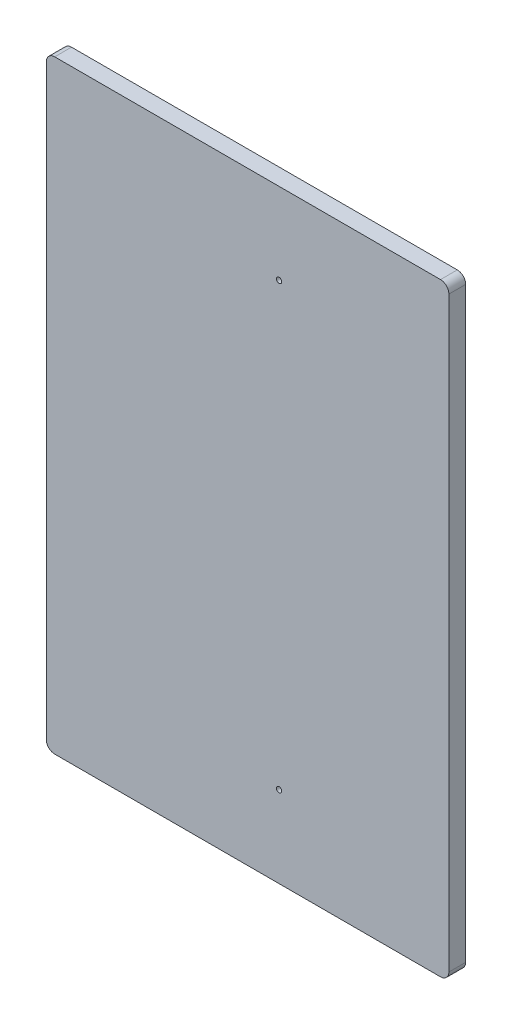
ISO-10303-21;
HEADER;
FILE_DESCRIPTION(('STEP AP214'),'2;1');
FILE_NAME('part.step','',(''),(''),'','','');
FILE_SCHEMA(('AUTOMOTIVE_DESIGN { 1 0 10303 214 1 1 1 1 }'));
ENDSEC;
DATA;
#1=APPLICATION_CONTEXT('core data for automotive mechanical design processes');
#2=APPLICATION_PROTOCOL_DEFINITION('international standard','automotive_design',2000,#1);
#3=PRODUCT_CONTEXT('',#1,'mechanical');
#4=PRODUCT('Part','Part','',(#3));
#5=PRODUCT_RELATED_PRODUCT_CATEGORY('part','',(#4));
#6=PRODUCT_DEFINITION_FORMATION('','',#4);
#7=PRODUCT_DEFINITION_CONTEXT('part definition',#1,'design');
#8=PRODUCT_DEFINITION('design','',#6,#7);
#9=PRODUCT_DEFINITION_SHAPE('','',#8);
#10=(LENGTH_UNIT() NAMED_UNIT(*) SI_UNIT(.MILLI.,.METRE.));
#11=(NAMED_UNIT(*) PLANE_ANGLE_UNIT() SI_UNIT($,.RADIAN.));
#12=(NAMED_UNIT(*) SI_UNIT($,.STERADIAN.) SOLID_ANGLE_UNIT());
#13=UNCERTAINTY_MEASURE_WITH_UNIT(LENGTH_MEASURE(1.E-05),#10,'distance_accuracy_value','');
#14=(GEOMETRIC_REPRESENTATION_CONTEXT(3) GLOBAL_UNCERTAINTY_ASSIGNED_CONTEXT((#13)) GLOBAL_UNIT_ASSIGNED_CONTEXT((#10,
#11,#12)) REPRESENTATION_CONTEXT('',''));
#15=CARTESIAN_POINT('',(0.,0.,0.));
#16=DIRECTION('',(0.,0.,1.));
#17=DIRECTION('',(1.,0.,0.));
#18=AXIS2_PLACEMENT_3D('',#15,#16,#17);
#19=CARTESIAN_POINT('',(152.4,228.6,12.7));
#20=DIRECTION('',(-1.,0.,0.));
#21=DIRECTION('',(0.,0.,1.));
#22=AXIS2_PLACEMENT_3D('',#19,#20,#21);
#23=PLANE('',#22);
#24=DIRECTION('',(0.,1.,0.));
#25=VECTOR('',#24,1.);
#26=CARTESIAN_POINT('',(152.4,228.6,0.));
#27=LINE('',#26,#25);
#28=CARTESIAN_POINT('',(152.4,-222.25,0.));
#29=VERTEX_POINT('',#28);
#30=CARTESIAN_POINT('',(152.4,222.25,0.));
#31=VERTEX_POINT('',#30);
#32=EDGE_CURVE('E128',#29,#31,#27,.T.);
#33=ORIENTED_EDGE('',*,*,#32,.T.);
#34=DIRECTION('',(0.,0.,-1.));
#35=VECTOR('',#34,1.);
#36=CARTESIAN_POINT('',(152.4,222.25,12.7));
#37=LINE('',#36,#35);
#38=CARTESIAN_POINT('',(152.4,222.25,12.7));
#39=VERTEX_POINT('',#38);
#40=EDGE_CURVE('E106',#31,#39,#37,.F.);
#41=ORIENTED_EDGE('',*,*,#40,.T.);
#42=DIRECTION('',(0.,1.,0.));
#43=VECTOR('',#42,1.);
#44=CARTESIAN_POINT('',(152.4,228.6,12.7));
#45=LINE('',#44,#43);
#46=CARTESIAN_POINT('',(152.4,-222.25,12.7));
#47=VERTEX_POINT('',#46);
#48=EDGE_CURVE('E138',#47,#39,#45,.T.);
#49=ORIENTED_EDGE('',*,*,#48,.F.);
#50=DIRECTION('',(0.,0.,-1.));
#51=VECTOR('',#50,1.);
#52=CARTESIAN_POINT('',(152.4,-222.25,12.7));
#53=LINE('',#52,#51);
#54=EDGE_CURVE('E111',#47,#29,#53,.T.);
#55=ORIENTED_EDGE('',*,*,#54,.T.);
#56=EDGE_LOOP('',(#33,#41,#49,#55));
#57=FACE_BOUND('',#56,.T.);
#58=ADVANCED_FACE('F35',(#57),#23,.F.);
#59=CARTESIAN_POINT('',(152.4,228.6,12.7));
#60=DIRECTION('',(0.,-1.,0.));
#61=DIRECTION('',(0.,0.,-1.));
#62=AXIS2_PLACEMENT_3D('',#59,#60,#61);
#63=PLANE('',#62);
#64=DIRECTION('',(-1.,0.,0.));
#65=VECTOR('',#64,1.);
#66=CARTESIAN_POINT('',(152.4,228.6,12.7));
#67=LINE('',#66,#65);
#68=CARTESIAN_POINT('',(146.05,228.6,12.7));
#69=VERTEX_POINT('',#68);
#70=CARTESIAN_POINT('',(-146.05,228.6,12.7));
#71=VERTEX_POINT('',#70);
#72=EDGE_CURVE('E121',#69,#71,#67,.T.);
#73=ORIENTED_EDGE('',*,*,#72,.F.);
#74=DIRECTION('',(0.,0.,-1.));
#75=VECTOR('',#74,1.);
#76=CARTESIAN_POINT('',(146.05,228.6,12.7));
#77=LINE('',#76,#75);
#78=CARTESIAN_POINT('',(146.05,228.6,0.));
#79=VERTEX_POINT('',#78);
#80=EDGE_CURVE('E105',#69,#79,#77,.T.);
#81=ORIENTED_EDGE('',*,*,#80,.T.);
#82=DIRECTION('',(-1.,0.,0.));
#83=VECTOR('',#82,1.);
#84=CARTESIAN_POINT('',(152.4,228.6,0.));
#85=LINE('',#84,#83);
#86=CARTESIAN_POINT('',(-146.05,228.6,0.));
#87=VERTEX_POINT('',#86);
#88=EDGE_CURVE('E118',#79,#87,#85,.T.);
#89=ORIENTED_EDGE('',*,*,#88,.T.);
#90=DIRECTION('',(0.,0.,-1.));
#91=VECTOR('',#90,1.);
#92=CARTESIAN_POINT('',(-146.05,228.6,12.7));
#93=LINE('',#92,#91);
#94=EDGE_CURVE('E123',#87,#71,#93,.F.);
#95=ORIENTED_EDGE('',*,*,#94,.T.);
#96=EDGE_LOOP('',(#73,#81,#89,#95));
#97=FACE_BOUND('',#96,.T.);
#98=ADVANCED_FACE('F117',(#97),#63,.F.);
#99=CARTESIAN_POINT('',(-152.4,228.6,12.7));
#100=DIRECTION('',(1.,0.,0.));
#101=DIRECTION('',(0.,0.,-1.));
#102=AXIS2_PLACEMENT_3D('',#99,#100,#101);
#103=PLANE('',#102);
#104=DIRECTION('',(0.,-1.,0.));
#105=VECTOR('',#104,1.);
#106=CARTESIAN_POINT('',(-152.4,228.6,0.));
#107=LINE('',#106,#105);
#108=CARTESIAN_POINT('',(-152.4,222.25,0.));
#109=VERTEX_POINT('',#108);
#110=CARTESIAN_POINT('',(-152.4,-222.25,0.));
#111=VERTEX_POINT('',#110);
#112=EDGE_CURVE('E127',#109,#111,#107,.T.);
#113=ORIENTED_EDGE('',*,*,#112,.T.);
#114=DIRECTION('',(0.,0.,-1.));
#115=VECTOR('',#114,1.);
#116=CARTESIAN_POINT('',(-152.4,-222.25,12.7));
#117=LINE('',#116,#115);
#118=CARTESIAN_POINT('',(-152.4,-222.25,12.7));
#119=VERTEX_POINT('',#118);
#120=EDGE_CURVE('E11',#111,#119,#117,.F.);
#121=ORIENTED_EDGE('',*,*,#120,.T.);
#122=DIRECTION('',(0.,-1.,0.));
#123=VECTOR('',#122,1.);
#124=CARTESIAN_POINT('',(-152.4,228.6,12.7));
#125=LINE('',#124,#123);
#126=CARTESIAN_POINT('',(-152.4,222.25,12.7));
#127=VERTEX_POINT('',#126);
#128=EDGE_CURVE('E164',#127,#119,#125,.T.);
#129=ORIENTED_EDGE('',*,*,#128,.F.);
#130=DIRECTION('',(0.,0.,-1.));
#131=VECTOR('',#130,1.);
#132=CARTESIAN_POINT('',(-152.4,222.25,12.7));
#133=LINE('',#132,#131);
#134=EDGE_CURVE('E43',#127,#109,#133,.T.);
#135=ORIENTED_EDGE('',*,*,#134,.T.);
#136=EDGE_LOOP('',(#113,#121,#129,#135));
#137=FACE_BOUND('',#136,.T.);
#138=ADVANCED_FACE('F162',(#137),#103,.F.);
#139=CARTESIAN_POINT('',(152.4,-228.6,12.7));
#140=DIRECTION('',(0.,1.,0.));
#141=DIRECTION('',(0.,0.,1.));
#142=AXIS2_PLACEMENT_3D('',#139,#140,#141);
#143=PLANE('',#142);
#144=DIRECTION('',(1.,0.,0.));
#145=VECTOR('',#144,1.);
#146=CARTESIAN_POINT('',(152.4,-228.6,0.));
#147=LINE('',#146,#145);
#148=CARTESIAN_POINT('',(-146.05,-228.6,0.));
#149=VERTEX_POINT('',#148);
#150=CARTESIAN_POINT('',(146.05,-228.6,0.));
#151=VERTEX_POINT('',#150);
#152=EDGE_CURVE('E131',#149,#151,#147,.T.);
#153=ORIENTED_EDGE('',*,*,#152,.T.);
#154=DIRECTION('',(0.,0.,-1.));
#155=VECTOR('',#154,1.);
#156=CARTESIAN_POINT('',(146.05,-228.6,12.7));
#157=LINE('',#156,#155);
#158=CARTESIAN_POINT('',(146.05,-228.6,12.7));
#159=VERTEX_POINT('',#158);
#160=EDGE_CURVE('E50',#151,#159,#157,.F.);
#161=ORIENTED_EDGE('',*,*,#160,.T.);
#162=DIRECTION('',(1.,0.,0.));
#163=VECTOR('',#162,1.);
#164=CARTESIAN_POINT('',(152.4,-228.6,12.7));
#165=LINE('',#164,#163);
#166=CARTESIAN_POINT('',(-146.05,-228.6,12.7));
#167=VERTEX_POINT('',#166);
#168=EDGE_CURVE('E139',#167,#159,#165,.T.);
#169=ORIENTED_EDGE('',*,*,#168,.F.);
#170=DIRECTION('',(0.,0.,-1.));
#171=VECTOR('',#170,1.);
#172=CARTESIAN_POINT('',(-146.05,-228.6,12.7));
#173=LINE('',#172,#171);
#174=EDGE_CURVE('E155',#167,#149,#173,.T.);
#175=ORIENTED_EDGE('',*,*,#174,.T.);
#176=EDGE_LOOP('',(#153,#161,#169,#175));
#177=FACE_BOUND('',#176,.T.);
#178=ADVANCED_FACE('F171',(#177),#143,.F.);
#179=CARTESIAN_POINT('',(152.4,-228.6,12.7));
#180=DIRECTION('',(0.,0.,-1.));
#181=DIRECTION('',(-1.,0.,0.));
#182=AXIS2_PLACEMENT_3D('',#179,#180,#181);
#183=PLANE('',#182);
#184=CARTESIAN_POINT('',(23.8125,-167.005,12.7));
#185=DIRECTION('',(0.,0.,-1.));
#186=DIRECTION('',(-1.,0.,0.));
#187=AXIS2_PLACEMENT_3D('',#184,#185,#186);
#188=CIRCLE('',#187,2.0193);
#189=CARTESIAN_POINT('',(21.7932,-167.005,12.7));
#190=VERTEX_POINT('',#189);
#191=EDGE_CURVE('E183',#190,#190,#188,.T.);
#192=ORIENTED_EDGE('',*,*,#191,.T.);
#193=EDGE_LOOP('',(#192));
#194=FACE_BOUND('',#193,.T.);
#195=CARTESIAN_POINT('',(23.8125,167.005,12.7));
#196=DIRECTION('',(0.,0.,-1.));
#197=DIRECTION('',(-1.,0.,0.));
#198=AXIS2_PLACEMENT_3D('',#195,#196,#197);
#199=CIRCLE('',#198,2.0193);
#200=CARTESIAN_POINT('',(21.7932,167.005,12.7));
#201=VERTEX_POINT('',#200);
#202=EDGE_CURVE('E133',#201,#201,#199,.T.);
#203=ORIENTED_EDGE('',*,*,#202,.T.);
#204=EDGE_LOOP('',(#203));
#205=FACE_BOUND('',#204,.T.);
#206=ORIENTED_EDGE('',*,*,#48,.T.);
#207=CARTESIAN_POINT('',(146.05,222.25,12.7));
#208=DIRECTION('',(0.,0.,-1.));
#209=DIRECTION('',(-1.,0.,0.));
#210=AXIS2_PLACEMENT_3D('',#207,#208,#209);
#211=CIRCLE('',#210,6.35);
#212=EDGE_CURVE('E153',#39,#69,#211,.F.);
#213=ORIENTED_EDGE('',*,*,#212,.T.);
#214=ORIENTED_EDGE('',*,*,#72,.T.);
#215=CARTESIAN_POINT('',(-146.05,222.25,12.7));
#216=DIRECTION('',(0.,0.,-1.));
#217=DIRECTION('',(-1.,0.,0.));
#218=AXIS2_PLACEMENT_3D('',#215,#216,#217);
#219=CIRCLE('',#218,6.35);
#220=EDGE_CURVE('E148',#71,#127,#219,.F.);
#221=ORIENTED_EDGE('',*,*,#220,.T.);
#222=ORIENTED_EDGE('',*,*,#128,.T.);
#223=CARTESIAN_POINT('',(-146.05,-222.25,12.7));
#224=DIRECTION('',(0.,0.,-1.));
#225=DIRECTION('',(-1.,0.,0.));
#226=AXIS2_PLACEMENT_3D('',#223,#224,#225);
#227=CIRCLE('',#226,6.35);
#228=EDGE_CURVE('E57',#119,#167,#227,.F.);
#229=ORIENTED_EDGE('',*,*,#228,.T.);
#230=ORIENTED_EDGE('',*,*,#168,.T.);
#231=CARTESIAN_POINT('',(146.05,-222.25,12.7));
#232=DIRECTION('',(0.,0.,-1.));
#233=DIRECTION('',(-1.,0.,0.));
#234=AXIS2_PLACEMENT_3D('',#231,#232,#233);
#235=CIRCLE('',#234,6.35);
#236=EDGE_CURVE('E151',#159,#47,#235,.F.);
#237=ORIENTED_EDGE('',*,*,#236,.T.);
#238=EDGE_LOOP('',(#206,#213,#214,#221,#222,#229,#230,#237));
#239=FACE_BOUND('',#238,.T.);
#240=ADVANCED_FACE('F194',(#194,#205,#239),#183,.F.);
#241=CARTESIAN_POINT('',(152.4,-228.6,0.));
#242=DIRECTION('',(0.,0.,-1.));
#243=DIRECTION('',(-1.,0.,0.));
#244=AXIS2_PLACEMENT_3D('',#241,#242,#243);
#245=PLANE('',#244);
#246=CARTESIAN_POINT('',(23.8125,-167.005,0.));
#247=DIRECTION('',(0.,0.,-1.));
#248=DIRECTION('',(-1.,0.,0.));
#249=AXIS2_PLACEMENT_3D('',#246,#247,#248);
#250=CIRCLE('',#249,2.01929999999999);
#251=CARTESIAN_POINT('',(21.7932,-167.005,0.));
#252=VERTEX_POINT('',#251);
#253=EDGE_CURVE('E186',#252,#252,#250,.T.);
#254=ORIENTED_EDGE('',*,*,#253,.F.);
#255=EDGE_LOOP('',(#254));
#256=FACE_BOUND('',#255,.T.);
#257=CARTESIAN_POINT('',(23.8125,167.005,0.));
#258=DIRECTION('',(0.,0.,-1.));
#259=DIRECTION('',(-1.,0.,0.));
#260=AXIS2_PLACEMENT_3D('',#257,#258,#259);
#261=CIRCLE('',#260,2.01929999999999);
#262=CARTESIAN_POINT('',(21.7932,167.005,0.));
#263=VERTEX_POINT('',#262);
#264=EDGE_CURVE('E180',#263,#263,#261,.T.);
#265=ORIENTED_EDGE('',*,*,#264,.F.);
#266=EDGE_LOOP('',(#265));
#267=FACE_BOUND('',#266,.T.);
#268=ORIENTED_EDGE('',*,*,#88,.F.);
#269=CARTESIAN_POINT('',(146.05,222.25,0.));
#270=DIRECTION('',(0.,0.,-1.));
#271=DIRECTION('',(-1.,0.,0.));
#272=AXIS2_PLACEMENT_3D('',#269,#270,#271);
#273=CIRCLE('',#272,6.35);
#274=EDGE_CURVE('E101',#79,#31,#273,.T.);
#275=ORIENTED_EDGE('',*,*,#274,.T.);
#276=ORIENTED_EDGE('',*,*,#32,.F.);
#277=CARTESIAN_POINT('',(146.05,-222.25,0.));
#278=DIRECTION('',(0.,0.,-1.));
#279=DIRECTION('',(-1.,0.,0.));
#280=AXIS2_PLACEMENT_3D('',#277,#278,#279);
#281=CIRCLE('',#280,6.35);
#282=EDGE_CURVE('E112',#29,#151,#281,.T.);
#283=ORIENTED_EDGE('',*,*,#282,.T.);
#284=ORIENTED_EDGE('',*,*,#152,.F.);
#285=CARTESIAN_POINT('',(-146.05,-222.25,0.));
#286=DIRECTION('',(0.,0.,-1.));
#287=DIRECTION('',(-1.,0.,0.));
#288=AXIS2_PLACEMENT_3D('',#285,#286,#287);
#289=CIRCLE('',#288,6.35);
#290=EDGE_CURVE('E142',#149,#111,#289,.T.);
#291=ORIENTED_EDGE('',*,*,#290,.T.);
#292=ORIENTED_EDGE('',*,*,#112,.F.);
#293=CARTESIAN_POINT('',(-146.05,222.25,0.));
#294=DIRECTION('',(0.,0.,-1.));
#295=DIRECTION('',(-1.,0.,0.));
#296=AXIS2_PLACEMENT_3D('',#293,#294,#295);
#297=CIRCLE('',#296,6.35);
#298=EDGE_CURVE('E122',#109,#87,#297,.T.);
#299=ORIENTED_EDGE('',*,*,#298,.T.);
#300=EDGE_LOOP('',(#268,#275,#276,#283,#284,#291,#292,#299));
#301=FACE_BOUND('',#300,.T.);
#302=ADVANCED_FACE('F125',(#256,#267,#301),#245,.T.);
#303=CARTESIAN_POINT('',(146.05,222.25,12.7));
#304=DIRECTION('',(0.,0.,-1.));
#305=DIRECTION('',(-1.,0.,0.));
#306=AXIS2_PLACEMENT_3D('',#303,#304,#305);
#307=CYLINDRICAL_SURFACE('',#306,6.35);
#308=ORIENTED_EDGE('',*,*,#212,.F.);
#309=ORIENTED_EDGE('',*,*,#40,.F.);
#310=ORIENTED_EDGE('',*,*,#274,.F.);
#311=ORIENTED_EDGE('',*,*,#80,.F.);
#312=EDGE_LOOP('',(#308,#309,#310,#311));
#313=FACE_BOUND('',#312,.T.);
#314=ADVANCED_FACE('F104',(#313),#307,.T.);
#315=CARTESIAN_POINT('',(146.05,-222.25,12.7));
#316=DIRECTION('',(0.,0.,-1.));
#317=DIRECTION('',(-1.,0.,0.));
#318=AXIS2_PLACEMENT_3D('',#315,#316,#317);
#319=CYLINDRICAL_SURFACE('',#318,6.35);
#320=ORIENTED_EDGE('',*,*,#236,.F.);
#321=ORIENTED_EDGE('',*,*,#160,.F.);
#322=ORIENTED_EDGE('',*,*,#282,.F.);
#323=ORIENTED_EDGE('',*,*,#54,.F.);
#324=EDGE_LOOP('',(#320,#321,#322,#323));
#325=FACE_BOUND('',#324,.T.);
#326=ADVANCED_FACE('F221',(#325),#319,.T.);
#327=CARTESIAN_POINT('',(-146.05,-222.25,12.7));
#328=DIRECTION('',(0.,0.,-1.));
#329=DIRECTION('',(-1.,0.,0.));
#330=AXIS2_PLACEMENT_3D('',#327,#328,#329);
#331=CYLINDRICAL_SURFACE('',#330,6.35);
#332=ORIENTED_EDGE('',*,*,#228,.F.);
#333=ORIENTED_EDGE('',*,*,#120,.F.);
#334=ORIENTED_EDGE('',*,*,#290,.F.);
#335=ORIENTED_EDGE('',*,*,#174,.F.);
#336=EDGE_LOOP('',(#332,#333,#334,#335));
#337=FACE_BOUND('',#336,.T.);
#338=ADVANCED_FACE('F170',(#337),#331,.T.);
#339=CARTESIAN_POINT('',(-146.05,222.25,12.7));
#340=DIRECTION('',(0.,0.,-1.));
#341=DIRECTION('',(-1.,0.,0.));
#342=AXIS2_PLACEMENT_3D('',#339,#340,#341);
#343=CYLINDRICAL_SURFACE('',#342,6.35);
#344=ORIENTED_EDGE('',*,*,#220,.F.);
#345=ORIENTED_EDGE('',*,*,#94,.F.);
#346=ORIENTED_EDGE('',*,*,#298,.F.);
#347=ORIENTED_EDGE('',*,*,#134,.F.);
#348=EDGE_LOOP('',(#344,#345,#346,#347));
#349=FACE_BOUND('',#348,.T.);
#350=ADVANCED_FACE('F37',(#349),#343,.T.);
#351=CARTESIAN_POINT('',(23.8125,167.005,0.));
#352=DIRECTION('',(0.,0.,-1.));
#353=DIRECTION('',(-1.,0.,0.));
#354=AXIS2_PLACEMENT_3D('',#351,#352,#353);
#355=CYLINDRICAL_SURFACE('',#354,2.01929999999999);
#356=ORIENTED_EDGE('',*,*,#202,.F.);
#357=EDGE_LOOP('',(#356));
#358=FACE_BOUND('',#357,.T.);
#359=ORIENTED_EDGE('',*,*,#264,.T.);
#360=EDGE_LOOP('',(#359));
#361=FACE_BOUND('',#360,.T.);
#362=ADVANCED_FACE('F198',(#358,#361),#355,.F.);
#363=CARTESIAN_POINT('',(23.8125,-167.005,0.));
#364=DIRECTION('',(0.,0.,-1.));
#365=DIRECTION('',(-1.,0.,0.));
#366=AXIS2_PLACEMENT_3D('',#363,#364,#365);
#367=CYLINDRICAL_SURFACE('',#366,2.01929999999999);
#368=ORIENTED_EDGE('',*,*,#191,.F.);
#369=EDGE_LOOP('',(#368));
#370=FACE_BOUND('',#369,.T.);
#371=ORIENTED_EDGE('',*,*,#253,.T.);
#372=EDGE_LOOP('',(#371));
#373=FACE_BOUND('',#372,.T.);
#374=ADVANCED_FACE('F190',(#370,#373),#367,.F.);
#375=CLOSED_SHELL('',(#58,#98,#138,#178,#240,#302,#314,#326,#338,#350,#362,#374));
#376=MANIFOLD_SOLID_BREP('B2',#375);
#377=ADVANCED_BREP_SHAPE_REPRESENTATION('',(#18,#376),#14);
#378=SHAPE_DEFINITION_REPRESENTATION(#9,#377);
ENDSEC;
END-ISO-10303-21;
